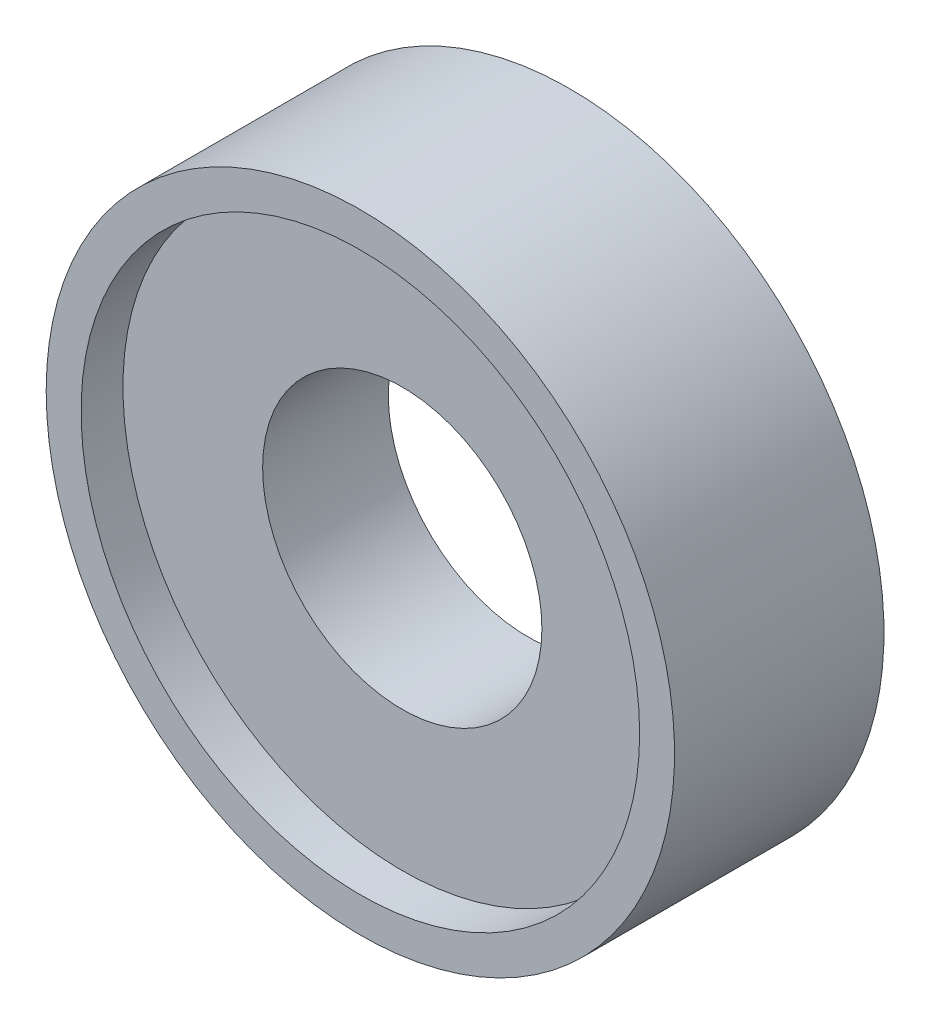
ISO-10303-21;
HEADER;
FILE_DESCRIPTION(('STEP AP214'),'2;1');
FILE_NAME('part.step','',(''),(''),'','','');
FILE_SCHEMA(('AUTOMOTIVE_DESIGN { 1 0 10303 214 1 1 1 1 }'));
ENDSEC;
DATA;
#1=APPLICATION_CONTEXT('core data for automotive mechanical design processes');
#2=APPLICATION_PROTOCOL_DEFINITION('international standard','automotive_design',2000,#1);
#3=PRODUCT_CONTEXT('',#1,'mechanical');
#4=PRODUCT('Part','Part','',(#3));
#5=PRODUCT_RELATED_PRODUCT_CATEGORY('part','',(#4));
#6=PRODUCT_DEFINITION_FORMATION('','',#4);
#7=PRODUCT_DEFINITION_CONTEXT('part definition',#1,'design');
#8=PRODUCT_DEFINITION('design','',#6,#7);
#9=PRODUCT_DEFINITION_SHAPE('','',#8);
#10=(LENGTH_UNIT() NAMED_UNIT(*) SI_UNIT(.MILLI.,.METRE.));
#11=(NAMED_UNIT(*) PLANE_ANGLE_UNIT() SI_UNIT($,.RADIAN.));
#12=(NAMED_UNIT(*) SI_UNIT($,.STERADIAN.) SOLID_ANGLE_UNIT());
#13=UNCERTAINTY_MEASURE_WITH_UNIT(LENGTH_MEASURE(1.E-05),#10,'distance_accuracy_value','');
#14=(GEOMETRIC_REPRESENTATION_CONTEXT(3) GLOBAL_UNCERTAINTY_ASSIGNED_CONTEXT((#13)) GLOBAL_UNIT_ASSIGNED_CONTEXT((#10,
#11,#12)) REPRESENTATION_CONTEXT('',''));
#15=CARTESIAN_POINT('',(0.,0.,0.));
#16=DIRECTION('',(0.,0.,1.));
#17=DIRECTION('',(1.,0.,0.));
#18=AXIS2_PLACEMENT_3D('',#15,#16,#17);
#19=CARTESIAN_POINT('',(0.,0.,0.));
#20=DIRECTION('',(0.,0.,1.));
#21=DIRECTION('',(1.,0.,0.));
#22=AXIS2_PLACEMENT_3D('',#19,#20,#21);
#23=CYLINDRICAL_SURFACE('',#22,25.4);
#24=CARTESIAN_POINT('',(0.,0.,30.48));
#25=DIRECTION('',(0.,0.,1.));
#26=DIRECTION('',(1.,0.,0.));
#27=AXIS2_PLACEMENT_3D('',#24,#25,#26);
#28=CIRCLE('',#27,25.4);
#29=CARTESIAN_POINT('',(25.4,0.,30.48));
#30=VERTEX_POINT('',#29);
#31=EDGE_CURVE('E45',#30,#30,#28,.F.);
#32=CARTESIAN_POINT('',(0.,0.,7.62));
#33=DIRECTION('',(0.,0.,-1.));
#34=DIRECTION('',(-1.,0.,0.));
#35=AXIS2_PLACEMENT_3D('',#32,#33,#34);
#36=CIRCLE('',#35,25.4);
#37=CARTESIAN_POINT('',(25.4,0.,7.62));
#38=VERTEX_POINT('',#37);
#39=EDGE_CURVE('E36',#38,#38,#36,.F.);
#40=CARTESIAN_POINT('',(25.4,0.,30.48));
#41=CARTESIAN_POINT('',(25.4,0.,30.241875));
#42=CARTESIAN_POINT('',(25.4,0.,30.00375));
#43=CARTESIAN_POINT('',(25.4,0.,29.5275));
#44=CARTESIAN_POINT('',(25.4,0.,29.289375));
#45=CARTESIAN_POINT('',(25.4,0.,28.813125));
#46=CARTESIAN_POINT('',(25.4,0.,28.575));
#47=CARTESIAN_POINT('',(25.4,0.,28.09875));
#48=CARTESIAN_POINT('',(25.4,0.,27.860625));
#49=CARTESIAN_POINT('',(25.4,0.,27.384375));
#50=CARTESIAN_POINT('',(25.4,0.,27.14625));
#51=CARTESIAN_POINT('',(25.4,0.,26.67));
#52=CARTESIAN_POINT('',(25.4,0.,26.431875));
#53=CARTESIAN_POINT('',(25.4,0.,25.955625));
#54=CARTESIAN_POINT('',(25.4,0.,25.7175));
#55=CARTESIAN_POINT('',(25.4,0.,25.24125));
#56=CARTESIAN_POINT('',(25.4,0.,25.003125));
#57=CARTESIAN_POINT('',(25.4,0.,24.526875));
#58=CARTESIAN_POINT('',(25.4,0.,24.28875));
#59=CARTESIAN_POINT('',(25.4,0.,23.8125));
#60=CARTESIAN_POINT('',(25.4,0.,23.574375));
#61=CARTESIAN_POINT('',(25.4,0.,23.098125));
#62=CARTESIAN_POINT('',(25.4,0.,22.86));
#63=CARTESIAN_POINT('',(25.4,0.,22.38375));
#64=CARTESIAN_POINT('',(25.4,0.,22.145625));
#65=CARTESIAN_POINT('',(25.4,0.,21.669375));
#66=CARTESIAN_POINT('',(25.4,0.,21.43125));
#67=CARTESIAN_POINT('',(25.4,0.,20.955));
#68=CARTESIAN_POINT('',(25.4,0.,20.716875));
#69=CARTESIAN_POINT('',(25.4,0.,20.240625));
#70=CARTESIAN_POINT('',(25.4,0.,20.0025));
#71=CARTESIAN_POINT('',(25.4,0.,19.52625));
#72=CARTESIAN_POINT('',(25.4,0.,19.288125));
#73=CARTESIAN_POINT('',(25.4,0.,18.811875));
#74=CARTESIAN_POINT('',(25.4,0.,18.57375));
#75=CARTESIAN_POINT('',(25.4,0.,18.0975));
#76=CARTESIAN_POINT('',(25.4,0.,17.859375));
#77=CARTESIAN_POINT('',(25.4,0.,17.383125));
#78=CARTESIAN_POINT('',(25.4,0.,17.145));
#79=CARTESIAN_POINT('',(25.4,0.,16.66875));
#80=CARTESIAN_POINT('',(25.4,0.,16.430625));
#81=CARTESIAN_POINT('',(25.4,0.,15.954375));
#82=CARTESIAN_POINT('',(25.4,0.,15.71625));
#83=CARTESIAN_POINT('',(25.4,0.,15.24));
#84=CARTESIAN_POINT('',(25.4,0.,15.001875));
#85=CARTESIAN_POINT('',(25.4,0.,14.525625));
#86=CARTESIAN_POINT('',(25.4,0.,14.2875));
#87=CARTESIAN_POINT('',(25.4,0.,13.81125));
#88=CARTESIAN_POINT('',(25.4,0.,13.573125));
#89=CARTESIAN_POINT('',(25.4,0.,13.096875));
#90=CARTESIAN_POINT('',(25.4,0.,12.85875));
#91=CARTESIAN_POINT('',(25.4,0.,12.3825));
#92=CARTESIAN_POINT('',(25.4,0.,12.144375));
#93=CARTESIAN_POINT('',(25.4,0.,11.668125));
#94=CARTESIAN_POINT('',(25.4,0.,11.43));
#95=CARTESIAN_POINT('',(25.4,0.,10.95375));
#96=CARTESIAN_POINT('',(25.4,0.,10.715625));
#97=CARTESIAN_POINT('',(25.4,0.,10.239375));
#98=CARTESIAN_POINT('',(25.4,0.,10.00125));
#99=CARTESIAN_POINT('',(25.4,0.,9.525));
#100=CARTESIAN_POINT('',(25.4,0.,9.286875));
#101=CARTESIAN_POINT('',(25.4,0.,8.810625));
#102=CARTESIAN_POINT('',(25.4,0.,8.5725));
#103=CARTESIAN_POINT('',(25.4,0.,8.09625));
#104=CARTESIAN_POINT('',(25.4,0.,7.858125));
#105=CARTESIAN_POINT('',(25.4,0.,7.62));
#106=B_SPLINE_CURVE_WITH_KNOTS('',3,(#40,#41,#42,#43,#44,#45,#46,#47,#48,#49,#50,#51,#52,#53,
#54,#55,#56,#57,#58,#59,#60,#61,#62,#63,#64,#65,#66,#67,#68,#69,#70,#71,#72,#73,#74,#75,#76,#77,
#78,#79,#80,#81,#82,#83,#84,#85,#86,#87,#88,#89,#90,#91,#92,#93,#94,#95,#96,#97,#98,#99,#100,
#101,#102,#103,#104,#105),.UNSPECIFIED.,.F.,.F.,(4,2,2,2,2,2,2,2,2,2,2,2,2,2,2,2,2,2,2,2,2,2,2,
2,2,2,2,2,2,2,2,2,4),(0.,0.714375,1.42875,2.143125,2.8575,3.571875,4.28625,5.000625,5.715,
6.429375,7.14375,7.858125,8.5725,9.286875,10.00125,10.715625,11.43,12.144375,12.85875,13.573125,
14.2875,15.001875,15.71625,16.430625,17.145,17.859375,18.57375,19.288125,20.0025,20.716875,
21.43125,22.145625,22.86),.UNSPECIFIED.);
#107=EDGE_CURVE('BSEAM32',#30,#38,#106,.T.);
#108=ORIENTED_EDGE('',*,*,#31,.F.);
#109=ORIENTED_EDGE('',*,*,#39,.F.);
#110=ORIENTED_EDGE('',*,*,#107,.T.);
#111=ORIENTED_EDGE('',*,*,#107,.F.);
#112=EDGE_LOOP('',(#108,#110,#109,#111));
#113=FACE_BOUND('',#112,.T.);
#114=ADVANCED_FACE('F32',(#113),#23,.F.);
#115=CARTESIAN_POINT('',(0.,0.,38.1));
#116=DIRECTION('',(0.,0.,-1.));
#117=DIRECTION('',(-1.,0.,0.));
#118=AXIS2_PLACEMENT_3D('',#115,#116,#117);
#119=CYLINDRICAL_SURFACE('',#118,57.15);
#120=CARTESIAN_POINT('',(0.,0.,38.1));
#121=DIRECTION('',(0.,0.,1.));
#122=DIRECTION('',(1.,0.,0.));
#123=AXIS2_PLACEMENT_3D('',#120,#121,#122);
#124=CIRCLE('',#123,57.15);
#125=CARTESIAN_POINT('',(-57.15,0.,38.1));
#126=VERTEX_POINT('',#125);
#127=EDGE_CURVE('E10',#126,#126,#124,.T.);
#128=CARTESIAN_POINT('',(0.,0.,0.));
#129=DIRECTION('',(0.,0.,1.));
#130=DIRECTION('',(1.,0.,0.));
#131=AXIS2_PLACEMENT_3D('',#128,#129,#130);
#132=CIRCLE('',#131,57.15);
#133=CARTESIAN_POINT('',(-57.15,0.,0.));
#134=VERTEX_POINT('',#133);
#135=EDGE_CURVE('E40',#134,#134,#132,.T.);
#136=CARTESIAN_POINT('',(-57.15,0.,38.1));
#137=CARTESIAN_POINT('',(-57.15,0.,37.703125));
#138=CARTESIAN_POINT('',(-57.15,0.,37.30625));
#139=CARTESIAN_POINT('',(-57.15,0.,36.5125));
#140=CARTESIAN_POINT('',(-57.15,0.,36.115625));
#141=CARTESIAN_POINT('',(-57.15,0.,35.321875));
#142=CARTESIAN_POINT('',(-57.15,0.,34.925));
#143=CARTESIAN_POINT('',(-57.15,0.,34.13125));
#144=CARTESIAN_POINT('',(-57.15,0.,33.734375));
#145=CARTESIAN_POINT('',(-57.15,0.,32.940625));
#146=CARTESIAN_POINT('',(-57.15,0.,32.54375));
#147=CARTESIAN_POINT('',(-57.15,0.,31.75));
#148=CARTESIAN_POINT('',(-57.15,0.,31.353125));
#149=CARTESIAN_POINT('',(-57.15,0.,30.559375));
#150=CARTESIAN_POINT('',(-57.15,0.,30.1625));
#151=CARTESIAN_POINT('',(-57.15,0.,29.36875));
#152=CARTESIAN_POINT('',(-57.15,0.,28.971875));
#153=CARTESIAN_POINT('',(-57.15,0.,28.178125));
#154=CARTESIAN_POINT('',(-57.15,0.,27.78125));
#155=CARTESIAN_POINT('',(-57.15,0.,26.9875));
#156=CARTESIAN_POINT('',(-57.15,0.,26.590625));
#157=CARTESIAN_POINT('',(-57.15,0.,25.796875));
#158=CARTESIAN_POINT('',(-57.15,0.,25.4));
#159=CARTESIAN_POINT('',(-57.15,0.,24.60625));
#160=CARTESIAN_POINT('',(-57.15,0.,24.209375));
#161=CARTESIAN_POINT('',(-57.15,0.,23.415625));
#162=CARTESIAN_POINT('',(-57.15,0.,23.01875));
#163=CARTESIAN_POINT('',(-57.15,0.,22.225));
#164=CARTESIAN_POINT('',(-57.15,0.,21.828125));
#165=CARTESIAN_POINT('',(-57.15,0.,21.034375));
#166=CARTESIAN_POINT('',(-57.15,0.,20.6375));
#167=CARTESIAN_POINT('',(-57.15,0.,19.84375));
#168=CARTESIAN_POINT('',(-57.15,0.,19.446875));
#169=CARTESIAN_POINT('',(-57.15,0.,18.653125));
#170=CARTESIAN_POINT('',(-57.15,0.,18.25625));
#171=CARTESIAN_POINT('',(-57.15,0.,17.4625));
#172=CARTESIAN_POINT('',(-57.15,0.,17.065625));
#173=CARTESIAN_POINT('',(-57.15,0.,16.271875));
#174=CARTESIAN_POINT('',(-57.15,0.,15.875));
#175=CARTESIAN_POINT('',(-57.15,0.,15.08125));
#176=CARTESIAN_POINT('',(-57.15,0.,14.684375));
#177=CARTESIAN_POINT('',(-57.15,0.,13.890625));
#178=CARTESIAN_POINT('',(-57.15,0.,13.49375));
#179=CARTESIAN_POINT('',(-57.15,0.,12.7));
#180=CARTESIAN_POINT('',(-57.15,0.,12.303125));
#181=CARTESIAN_POINT('',(-57.15,0.,11.509375));
#182=CARTESIAN_POINT('',(-57.15,0.,11.1125));
#183=CARTESIAN_POINT('',(-57.15,0.,10.31875));
#184=CARTESIAN_POINT('',(-57.15,0.,9.92187499999999));
#185=CARTESIAN_POINT('',(-57.15,0.,9.128125));
#186=CARTESIAN_POINT('',(-57.15,0.,8.73124999999999));
#187=CARTESIAN_POINT('',(-57.15,0.,7.93749999999999));
#188=CARTESIAN_POINT('',(-57.15,0.,7.54062499999999));
#189=CARTESIAN_POINT('',(-57.15,0.,6.746875));
#190=CARTESIAN_POINT('',(-57.15,0.,6.35));
#191=CARTESIAN_POINT('',(-57.15,0.,5.55625));
#192=CARTESIAN_POINT('',(-57.15,0.,5.159375));
#193=CARTESIAN_POINT('',(-57.15,0.,4.365625));
#194=CARTESIAN_POINT('',(-57.15,0.,3.96875));
#195=CARTESIAN_POINT('',(-57.15,0.,3.175));
#196=CARTESIAN_POINT('',(-57.15,0.,2.778125));
#197=CARTESIAN_POINT('',(-57.15,0.,1.984375));
#198=CARTESIAN_POINT('',(-57.15,0.,1.5875));
#199=CARTESIAN_POINT('',(-57.15,0.,0.79375));
#200=CARTESIAN_POINT('',(-57.15,0.,0.396875));
#201=CARTESIAN_POINT('',(-57.15,0.,0.));
#202=B_SPLINE_CURVE_WITH_KNOTS('',3,(#136,#137,#138,#139,#140,#141,#142,#143,#144,#145,#146,
#147,#148,#149,#150,#151,#152,#153,#154,#155,#156,#157,#158,#159,#160,#161,#162,#163,#164,#165,
#166,#167,#168,#169,#170,#171,#172,#173,#174,#175,#176,#177,#178,#179,#180,#181,#182,#183,#184,
#185,#186,#187,#188,#189,#190,#191,#192,#193,#194,#195,#196,#197,#198,#199,#200,#201),
.UNSPECIFIED.,.F.,.F.,(4,2,2,2,2,2,2,2,2,2,2,2,2,2,2,2,2,2,2,2,2,2,2,2,2,2,2,2,2,2,2,2,4),(0.,
1.190625,2.38125,3.571875,4.7625,5.953125,7.14375,8.334375,9.52500000000001,10.715625,11.90625,
13.096875,14.2875,15.478125,16.66875,17.859375,19.05,20.240625,21.43125,22.621875,23.8125,
25.003125,26.19375,27.384375,28.575,29.765625,30.95625,32.146875,33.3375,34.528125,35.71875,
36.909375,38.1),.UNSPECIFIED.);
#203=EDGE_CURVE('BSEAM34',#126,#134,#202,.T.);
#204=ORIENTED_EDGE('',*,*,#127,.F.);
#205=ORIENTED_EDGE('',*,*,#135,.T.);
#206=ORIENTED_EDGE('',*,*,#203,.T.);
#207=ORIENTED_EDGE('',*,*,#203,.F.);
#208=EDGE_LOOP('',(#204,#206,#205,#207));
#209=FACE_BOUND('',#208,.T.);
#210=ADVANCED_FACE('F34',(#209),#119,.T.);
#211=CARTESIAN_POINT('',(0.,0.,38.1));
#212=DIRECTION('',(0.,0.,1.));
#213=DIRECTION('',(1.,0.,0.));
#214=AXIS2_PLACEMENT_3D('',#211,#212,#213);
#215=PLANE('',#214);
#216=CARTESIAN_POINT('',(0.,0.,38.1));
#217=DIRECTION('',(0.,0.,1.));
#218=DIRECTION('',(1.,0.,0.));
#219=AXIS2_PLACEMENT_3D('',#216,#217,#218);
#220=CIRCLE('',#219,50.8);
#221=CARTESIAN_POINT('',(50.8,0.,38.1));
#222=VERTEX_POINT('',#221);
#223=EDGE_CURVE('E48',#222,#222,#220,.T.);
#224=ORIENTED_EDGE('',*,*,#223,.F.);
#225=EDGE_LOOP('',(#224));
#226=FACE_BOUND('',#225,.T.);
#227=ORIENTED_EDGE('',*,*,#127,.T.);
#228=EDGE_LOOP('',(#227));
#229=FACE_BOUND('',#228,.T.);
#230=ADVANCED_FACE('F77',(#226,#229),#215,.T.);
#231=CARTESIAN_POINT('',(0.,0.,0.));
#232=DIRECTION('',(0.,0.,1.));
#233=DIRECTION('',(1.,0.,0.));
#234=AXIS2_PLACEMENT_3D('',#231,#232,#233);
#235=PLANE('',#234);
#236=CARTESIAN_POINT('',(0.,0.,0.));
#237=DIRECTION('',(0.,0.,-1.));
#238=DIRECTION('',(-1.,0.,0.));
#239=AXIS2_PLACEMENT_3D('',#236,#237,#238);
#240=CIRCLE('',#239,50.8);
#241=CARTESIAN_POINT('',(-50.8,0.,0.));
#242=VERTEX_POINT('',#241);
#243=EDGE_CURVE('E59',#242,#242,#240,.T.);
#244=ORIENTED_EDGE('',*,*,#243,.F.);
#245=EDGE_LOOP('',(#244));
#246=FACE_BOUND('',#245,.T.);
#247=ORIENTED_EDGE('',*,*,#135,.F.);
#248=EDGE_LOOP('',(#247));
#249=FACE_BOUND('',#248,.T.);
#250=ADVANCED_FACE('F84',(#246,#249),#235,.F.);
#251=CARTESIAN_POINT('',(0.,0.,30.48));
#252=DIRECTION('',(0.,0.,1.));
#253=DIRECTION('',(1.,0.,0.));
#254=AXIS2_PLACEMENT_3D('',#251,#252,#253);
#255=PLANE('',#254);
#256=CARTESIAN_POINT('',(0.,0.,30.48));
#257=DIRECTION('',(0.,0.,1.));
#258=DIRECTION('',(1.,0.,0.));
#259=AXIS2_PLACEMENT_3D('',#256,#257,#258);
#260=CIRCLE('',#259,50.8);
#261=CARTESIAN_POINT('',(50.8,0.,30.48));
#262=VERTEX_POINT('',#261);
#263=EDGE_CURVE('E51',#262,#262,#260,.T.);
#264=ORIENTED_EDGE('',*,*,#263,.T.);
#265=EDGE_LOOP('',(#264));
#266=FACE_BOUND('',#265,.T.);
#267=ORIENTED_EDGE('',*,*,#31,.T.);
#268=EDGE_LOOP('',(#267));
#269=FACE_BOUND('',#268,.T.);
#270=ADVANCED_FACE('F87',(#266,#269),#255,.T.);
#271=CARTESIAN_POINT('',(0.,0.,30.48));
#272=DIRECTION('',(0.,0.,1.));
#273=DIRECTION('',(1.,0.,0.));
#274=AXIS2_PLACEMENT_3D('',#271,#272,#273);
#275=CYLINDRICAL_SURFACE('',#274,50.8);
#276=ORIENTED_EDGE('',*,*,#263,.F.);
#277=EDGE_LOOP('',(#276));
#278=FACE_BOUND('',#277,.T.);
#279=ORIENTED_EDGE('',*,*,#223,.T.);
#280=EDGE_LOOP('',(#279));
#281=FACE_BOUND('',#280,.T.);
#282=ADVANCED_FACE('F81',(#278,#281),#275,.F.);
#283=CARTESIAN_POINT('',(0.,0.,7.62));
#284=DIRECTION('',(0.,0.,-1.));
#285=DIRECTION('',(-1.,0.,0.));
#286=AXIS2_PLACEMENT_3D('',#283,#284,#285);
#287=PLANE('',#286);
#288=CARTESIAN_POINT('',(0.,0.,7.62));
#289=DIRECTION('',(0.,0.,-1.));
#290=DIRECTION('',(-1.,0.,0.));
#291=AXIS2_PLACEMENT_3D('',#288,#289,#290);
#292=CIRCLE('',#291,50.8);
#293=CARTESIAN_POINT('',(-50.8,0.,7.62));
#294=VERTEX_POINT('',#293);
#295=EDGE_CURVE('E62',#294,#294,#292,.T.);
#296=ORIENTED_EDGE('',*,*,#295,.T.);
#297=EDGE_LOOP('',(#296));
#298=FACE_BOUND('',#297,.T.);
#299=ORIENTED_EDGE('',*,*,#39,.T.);
#300=EDGE_LOOP('',(#299));
#301=FACE_BOUND('',#300,.T.);
#302=ADVANCED_FACE('F69',(#298,#301),#287,.T.);
#303=CARTESIAN_POINT('',(0.,0.,7.62));
#304=DIRECTION('',(0.,0.,-1.));
#305=DIRECTION('',(-1.,0.,0.));
#306=AXIS2_PLACEMENT_3D('',#303,#304,#305);
#307=CYLINDRICAL_SURFACE('',#306,50.8);
#308=ORIENTED_EDGE('',*,*,#295,.F.);
#309=EDGE_LOOP('',(#308));
#310=FACE_BOUND('',#309,.T.);
#311=ORIENTED_EDGE('',*,*,#243,.T.);
#312=EDGE_LOOP('',(#311));
#313=FACE_BOUND('',#312,.T.);
#314=ADVANCED_FACE('F97',(#310,#313),#307,.F.);
#315=CLOSED_SHELL('',(#114,#210,#230,#250,#270,#282,#302,#314));
#316=MANIFOLD_SOLID_BREP('B2',#315);
#317=ADVANCED_BREP_SHAPE_REPRESENTATION('',(#18,#316),#14);
#318=SHAPE_DEFINITION_REPRESENTATION(#9,#317);
ENDSEC;
END-ISO-10303-21;
